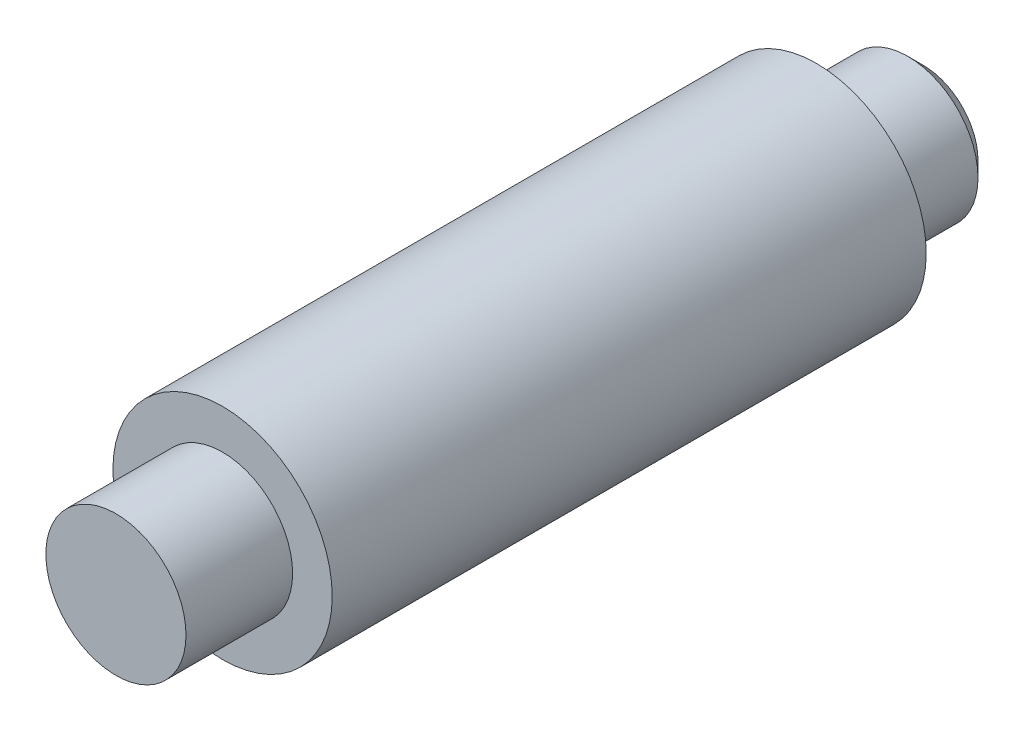
ISO-10303-21;
HEADER;
FILE_DESCRIPTION(('STEP AP214'),'2;1');
FILE_NAME('part.step','',(''),(''),'','','');
FILE_SCHEMA(('AUTOMOTIVE_DESIGN { 1 0 10303 214 1 1 1 1 }'));
ENDSEC;
DATA;
#1=APPLICATION_CONTEXT('core data for automotive mechanical design processes');
#2=APPLICATION_PROTOCOL_DEFINITION('international standard','automotive_design',2000,#1);
#3=PRODUCT_CONTEXT('',#1,'mechanical');
#4=PRODUCT('Part','Part','',(#3));
#5=PRODUCT_RELATED_PRODUCT_CATEGORY('part','',(#4));
#6=PRODUCT_DEFINITION_FORMATION('','',#4);
#7=PRODUCT_DEFINITION_CONTEXT('part definition',#1,'design');
#8=PRODUCT_DEFINITION('design','',#6,#7);
#9=PRODUCT_DEFINITION_SHAPE('','',#8);
#10=(LENGTH_UNIT() NAMED_UNIT(*) SI_UNIT(.MILLI.,.METRE.));
#11=(NAMED_UNIT(*) PLANE_ANGLE_UNIT() SI_UNIT($,.RADIAN.));
#12=(NAMED_UNIT(*) SI_UNIT($,.STERADIAN.) SOLID_ANGLE_UNIT());
#13=UNCERTAINTY_MEASURE_WITH_UNIT(LENGTH_MEASURE(1.E-05),#10,'distance_accuracy_value','');
#14=(GEOMETRIC_REPRESENTATION_CONTEXT(3) GLOBAL_UNCERTAINTY_ASSIGNED_CONTEXT((#13)) GLOBAL_UNIT_ASSIGNED_CONTEXT((#10,
#11,#12)) REPRESENTATION_CONTEXT('',''));
#15=CARTESIAN_POINT('',(0.,0.,0.));
#16=DIRECTION('',(0.,0.,1.));
#17=DIRECTION('',(1.,0.,0.));
#18=AXIS2_PLACEMENT_3D('',#15,#16,#17);
#19=CARTESIAN_POINT('',(0.,0.,19.5));
#20=DIRECTION('',(0.,0.,-1.));
#21=DIRECTION('',(-1.,0.,0.));
#22=AXIS2_PLACEMENT_3D('',#19,#20,#21);
#23=CYLINDRICAL_SURFACE('',#22,3.6);
#24=CARTESIAN_POINT('',(0.,0.,19.5));
#25=DIRECTION('',(0.,0.,1.));
#26=DIRECTION('',(1.,0.,0.));
#27=AXIS2_PLACEMENT_3D('',#24,#25,#26);
#28=CIRCLE('',#27,3.6);
#29=CARTESIAN_POINT('',(3.6,0.,19.5));
#30=VERTEX_POINT('',#29);
#31=EDGE_CURVE('E49',#30,#30,#28,.T.);
#32=ORIENTED_EDGE('',*,*,#31,.F.);
#33=EDGE_LOOP('',(#32));
#34=FACE_BOUND('',#33,.T.);
#35=CARTESIAN_POINT('',(0.,0.,0.));
#36=DIRECTION('',(0.,0.,1.));
#37=DIRECTION('',(1.,0.,0.));
#38=AXIS2_PLACEMENT_3D('',#35,#36,#37);
#39=CIRCLE('',#38,3.6);
#40=CARTESIAN_POINT('',(3.6,0.,0.));
#41=VERTEX_POINT('',#40);
#42=EDGE_CURVE('E52',#41,#41,#39,.T.);
#43=ORIENTED_EDGE('',*,*,#42,.T.);
#44=EDGE_LOOP('',(#43));
#45=FACE_BOUND('',#44,.T.);
#46=ADVANCED_FACE('F33',(#34,#45),#23,.T.);
#47=CARTESIAN_POINT('',(0.,0.,19.5));
#48=DIRECTION('',(0.,0.,1.));
#49=DIRECTION('',(1.,0.,0.));
#50=AXIS2_PLACEMENT_3D('',#47,#48,#49);
#51=PLANE('',#50);
#52=CARTESIAN_POINT('',(0.,0.,19.5));
#53=DIRECTION('',(0.,0.,1.));
#54=DIRECTION('',(1.,0.,0.));
#55=AXIS2_PLACEMENT_3D('',#52,#53,#54);
#56=CIRCLE('',#55,2.3);
#57=CARTESIAN_POINT('',(2.3,0.,19.5));
#58=VERTEX_POINT('',#57);
#59=EDGE_CURVE('E45',#58,#58,#56,.T.);
#60=ORIENTED_EDGE('',*,*,#59,.F.);
#61=EDGE_LOOP('',(#60));
#62=FACE_BOUND('',#61,.T.);
#63=ORIENTED_EDGE('',*,*,#31,.T.);
#64=EDGE_LOOP('',(#63));
#65=FACE_BOUND('',#64,.T.);
#66=ADVANCED_FACE('F73',(#62,#65),#51,.T.);
#67=CARTESIAN_POINT('',(0.,0.,0.));
#68=DIRECTION('',(0.,0.,1.));
#69=DIRECTION('',(1.,0.,0.));
#70=AXIS2_PLACEMENT_3D('',#67,#68,#69);
#71=PLANE('',#70);
#72=CARTESIAN_POINT('',(0.,0.,0.));
#73=DIRECTION('',(0.,0.,1.));
#74=DIRECTION('',(1.,0.,0.));
#75=AXIS2_PLACEMENT_3D('',#72,#73,#74);
#76=CIRCLE('',#75,2.3);
#77=CARTESIAN_POINT('',(2.3,0.,0.));
#78=VERTEX_POINT('',#77);
#79=EDGE_CURVE('E55',#78,#78,#76,.T.);
#80=ORIENTED_EDGE('',*,*,#79,.T.);
#81=EDGE_LOOP('',(#80));
#82=FACE_BOUND('',#81,.T.);
#83=ORIENTED_EDGE('',*,*,#42,.F.);
#84=EDGE_LOOP('',(#83));
#85=FACE_BOUND('',#84,.T.);
#86=ADVANCED_FACE('F76',(#82,#85),#71,.F.);
#87=CARTESIAN_POINT('',(0.,0.,-3.5));
#88=DIRECTION('',(0.,0.,1.));
#89=DIRECTION('',(1.,0.,0.));
#90=AXIS2_PLACEMENT_3D('',#87,#88,#89);
#91=CYLINDRICAL_SURFACE('',#90,2.3);
#92=CARTESIAN_POINT('',(0.,0.,-3.));
#93=DIRECTION('',(0.,0.,1.));
#94=DIRECTION('',(1.,0.,0.));
#95=AXIS2_PLACEMENT_3D('',#92,#93,#94);
#96=CIRCLE('',#95,2.3);
#97=CARTESIAN_POINT('',(2.3,0.,-3.));
#98=VERTEX_POINT('',#97);
#99=EDGE_CURVE('E41',#98,#98,#96,.T.);
#100=ORIENTED_EDGE('',*,*,#99,.T.);
#101=EDGE_LOOP('',(#100));
#102=FACE_BOUND('',#101,.T.);
#103=ORIENTED_EDGE('',*,*,#79,.F.);
#104=EDGE_LOOP('',(#103));
#105=FACE_BOUND('',#104,.T.);
#106=ADVANCED_FACE('F85',(#102,#105),#91,.T.);
#107=CARTESIAN_POINT('',(0.,0.,-3.5));
#108=DIRECTION('',(0.,0.,1.));
#109=DIRECTION('',(1.,0.,0.));
#110=AXIS2_PLACEMENT_3D('',#107,#108,#109);
#111=PLANE('',#110);
#112=CARTESIAN_POINT('',(0.,0.,-3.5));
#113=DIRECTION('',(0.,0.,1.));
#114=DIRECTION('',(1.,0.,0.));
#115=AXIS2_PLACEMENT_3D('',#112,#113,#114);
#116=CIRCLE('',#115,1.8);
#117=CARTESIAN_POINT('',(1.8,0.,-3.5));
#118=VERTEX_POINT('',#117);
#119=EDGE_CURVE('E10',#118,#118,#116,.F.);
#120=ORIENTED_EDGE('',*,*,#119,.T.);
#121=EDGE_LOOP('',(#120));
#122=FACE_BOUND('',#121,.T.);
#123=ADVANCED_FACE('F69',(#122),#111,.F.);
#124=CARTESIAN_POINT('',(0.,0.,23.));
#125=DIRECTION('',(0.,0.,-1.));
#126=DIRECTION('',(-1.,0.,0.));
#127=AXIS2_PLACEMENT_3D('',#124,#125,#126);
#128=CYLINDRICAL_SURFACE('',#127,2.3);
#129=CARTESIAN_POINT('',(0.,0.,23.));
#130=DIRECTION('',(0.,0.,1.));
#131=DIRECTION('',(1.,0.,0.));
#132=AXIS2_PLACEMENT_3D('',#129,#130,#131);
#133=CIRCLE('',#132,2.3);
#134=CARTESIAN_POINT('',(2.3,0.,23.));
#135=VERTEX_POINT('',#134);
#136=EDGE_CURVE('E59',#135,#135,#133,.T.);
#137=ORIENTED_EDGE('',*,*,#136,.F.);
#138=EDGE_LOOP('',(#137));
#139=FACE_BOUND('',#138,.T.);
#140=ORIENTED_EDGE('',*,*,#59,.T.);
#141=EDGE_LOOP('',(#140));
#142=FACE_BOUND('',#141,.T.);
#143=ADVANCED_FACE('F66',(#139,#142),#128,.T.);
#144=CARTESIAN_POINT('',(0.,0.,23.));
#145=DIRECTION('',(0.,0.,1.));
#146=DIRECTION('',(1.,0.,0.));
#147=AXIS2_PLACEMENT_3D('',#144,#145,#146);
#148=PLANE('',#147);
#149=ORIENTED_EDGE('',*,*,#136,.T.);
#150=EDGE_LOOP('',(#149));
#151=FACE_BOUND('',#150,.T.);
#152=ADVANCED_FACE('F64',(#151),#148,.T.);
#153=CARTESIAN_POINT('',(0.,0.,-3.));
#154=DIRECTION('',(0.,0.,1.));
#155=DIRECTION('',(1.,0.,0.));
#156=AXIS2_PLACEMENT_3D('',#153,#154,#155);
#157=CONICAL_SURFACE('',#156,2.3,0.785398163397449);
#158=ORIENTED_EDGE('',*,*,#119,.F.);
#159=EDGE_LOOP('',(#158));
#160=FACE_BOUND('',#159,.T.);
#161=ORIENTED_EDGE('',*,*,#99,.F.);
#162=EDGE_LOOP('',(#161));
#163=FACE_BOUND('',#162,.T.);
#164=ADVANCED_FACE('F36',(#160,#163),#157,.T.);
#165=CLOSED_SHELL('',(#46,#66,#86,#106,#123,#143,#152,#164));
#166=MANIFOLD_SOLID_BREP('B2',#165);
#167=ADVANCED_BREP_SHAPE_REPRESENTATION('',(#18,#166),#14);
#168=SHAPE_DEFINITION_REPRESENTATION(#9,#167);
ENDSEC;
END-ISO-10303-21;
